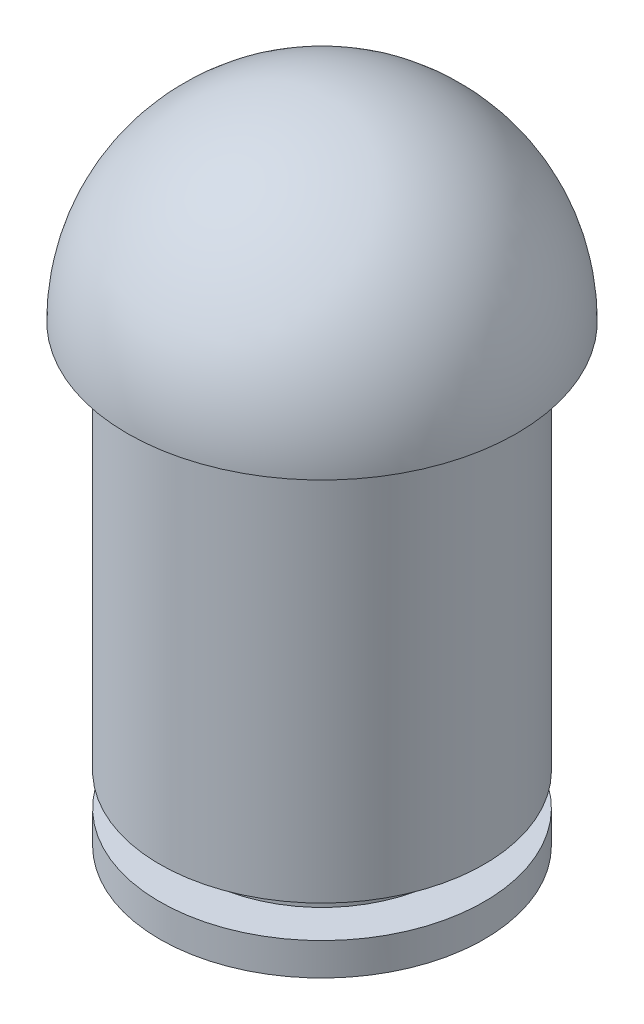
ISO-10303-21;
HEADER;
FILE_DESCRIPTION(('STEP AP214'),'2;1');
FILE_NAME('part.step','',(''),(''),'','','');
FILE_SCHEMA(('AUTOMOTIVE_DESIGN { 1 0 10303 214 1 1 1 1 }'));
ENDSEC;
DATA;
#1=APPLICATION_CONTEXT('core data for automotive mechanical design processes');
#2=APPLICATION_PROTOCOL_DEFINITION('international standard','automotive_design',2000,#1);
#3=PRODUCT_CONTEXT('',#1,'mechanical');
#4=PRODUCT('Part','Part','',(#3));
#5=PRODUCT_RELATED_PRODUCT_CATEGORY('part','',(#4));
#6=PRODUCT_DEFINITION_FORMATION('','',#4);
#7=PRODUCT_DEFINITION_CONTEXT('part definition',#1,'design');
#8=PRODUCT_DEFINITION('design','',#6,#7);
#9=PRODUCT_DEFINITION_SHAPE('','',#8);
#10=(LENGTH_UNIT() NAMED_UNIT(*) SI_UNIT(.MILLI.,.METRE.));
#11=(NAMED_UNIT(*) PLANE_ANGLE_UNIT() SI_UNIT($,.RADIAN.));
#12=(NAMED_UNIT(*) SI_UNIT($,.STERADIAN.) SOLID_ANGLE_UNIT());
#13=UNCERTAINTY_MEASURE_WITH_UNIT(LENGTH_MEASURE(1.E-05),#10,'distance_accuracy_value','');
#14=(GEOMETRIC_REPRESENTATION_CONTEXT(3) GLOBAL_UNCERTAINTY_ASSIGNED_CONTEXT((#13)) GLOBAL_UNIT_ASSIGNED_CONTEXT((#10,
#11,#12)) REPRESENTATION_CONTEXT('',''));
#15=CARTESIAN_POINT('',(0.,0.,0.));
#16=DIRECTION('',(0.,0.,1.));
#17=DIRECTION('',(1.,0.,0.));
#18=AXIS2_PLACEMENT_3D('',#15,#16,#17);
#19=CARTESIAN_POINT('',(0.,7.,0.));
#20=DIRECTION('',(0.,-1.,0.));
#21=DIRECTION('',(0.,0.,-1.));
#22=AXIS2_PLACEMENT_3D('',#19,#20,#21);
#23=CYLINDRICAL_SURFACE('',#22,2.5);
#24=CARTESIAN_POINT('',(0.,7.,0.));
#25=DIRECTION('',(0.,1.,0.));
#26=DIRECTION('',(0.,0.,1.));
#27=AXIS2_PLACEMENT_3D('',#24,#25,#26);
#28=CIRCLE('',#27,2.5);
#29=CARTESIAN_POINT('',(0.,7.,2.5));
#30=VERTEX_POINT('',#29);
#31=EDGE_CURVE('E10',#30,#30,#28,.T.);
#32=ORIENTED_EDGE('',*,*,#31,.F.);
#33=EDGE_LOOP('',(#32));
#34=FACE_BOUND('',#33,.T.);
#35=CARTESIAN_POINT('',(0.,1.,0.));
#36=DIRECTION('',(0.,1.,0.));
#37=DIRECTION('',(-1.,0.,0.));
#38=AXIS2_PLACEMENT_3D('',#35,#36,#37);
#39=CIRCLE('',#38,2.5);
#40=CARTESIAN_POINT('',(-2.5,1.,0.));
#41=VERTEX_POINT('',#40);
#42=EDGE_CURVE('E66',#41,#41,#39,.T.);
#43=ORIENTED_EDGE('',*,*,#42,.T.);
#44=EDGE_LOOP('',(#43));
#45=FACE_BOUND('',#44,.T.);
#46=ADVANCED_FACE('F37',(#34,#45),#23,.T.);
#47=CARTESIAN_POINT('',(0.,7.,0.));
#48=DIRECTION('',(0.,-1.,0.));
#49=DIRECTION('',(0.,0.,-1.));
#50=AXIS2_PLACEMENT_3D('',#47,#48,#49);
#51=PLANE('',#50);
#52=ORIENTED_EDGE('',*,*,#31,.T.);
#53=EDGE_LOOP('',(#52));
#54=FACE_BOUND('',#53,.T.);
#55=CARTESIAN_POINT('',(0.,7.,0.));
#56=DIRECTION('',(0.,-1.,0.));
#57=DIRECTION('',(0.,0.,-1.));
#58=AXIS2_PLACEMENT_3D('',#55,#56,#57);
#59=CIRCLE('',#58,3.);
#60=CARTESIAN_POINT('',(0.,7.,-3.));
#61=VERTEX_POINT('',#60);
#62=EDGE_CURVE('E49',#61,#61,#59,.T.);
#63=ORIENTED_EDGE('',*,*,#62,.T.);
#64=EDGE_LOOP('',(#63));
#65=FACE_BOUND('',#64,.T.);
#66=ADVANCED_FACE('F85',(#54,#65),#51,.T.);
#67=CARTESIAN_POINT('',(0.,7.,0.));
#68=DIRECTION('',(0.,-1.,0.));
#69=DIRECTION('',(1.,0.,0.));
#70=AXIS2_PLACEMENT_3D('',#67,#68,#69);
#71=SPHERICAL_SURFACE('',#70,3.);
#72=ORIENTED_EDGE('',*,*,#62,.F.);
#73=EDGE_LOOP('',(#72));
#74=FACE_BOUND('',#73,.T.);
#75=ADVANCED_FACE('F75',(#74),#71,.T.);
#76=CARTESIAN_POINT('',(2.5,1.,0.));
#77=DIRECTION('',(0.,-1.,0.));
#78=DIRECTION('',(1.,0.,0.));
#79=AXIS2_PLACEMENT_3D('',#76,#77,#78);
#80=PLANE('',#79);
#81=CARTESIAN_POINT('',(0.,1.,0.));
#82=DIRECTION('',(0.,1.,0.));
#83=DIRECTION('',(-1.,0.,0.));
#84=AXIS2_PLACEMENT_3D('',#81,#82,#83);
#85=CIRCLE('',#84,1.875);
#86=CARTESIAN_POINT('',(-1.875,1.,0.));
#87=VERTEX_POINT('',#86);
#88=EDGE_CURVE('E54',#87,#87,#85,.T.);
#89=ORIENTED_EDGE('',*,*,#88,.T.);
#90=EDGE_LOOP('',(#89));
#91=FACE_BOUND('',#90,.T.);
#92=ORIENTED_EDGE('',*,*,#42,.F.);
#93=EDGE_LOOP('',(#92));
#94=FACE_BOUND('',#93,.T.);
#95=ADVANCED_FACE('F72',(#91,#94),#80,.T.);
#96=CARTESIAN_POINT('',(0.,7.,0.));
#97=DIRECTION('',(0.,1.,0.));
#98=DIRECTION('',(-1.,0.,0.));
#99=AXIS2_PLACEMENT_3D('',#96,#97,#98);
#100=CYLINDRICAL_SURFACE('',#99,1.875);
#101=CARTESIAN_POINT('',(0.,0.5,0.));
#102=DIRECTION('',(0.,1.,0.));
#103=DIRECTION('',(-1.,0.,0.));
#104=AXIS2_PLACEMENT_3D('',#101,#102,#103);
#105=CIRCLE('',#104,1.875);
#106=CARTESIAN_POINT('',(-1.875,0.499999999999999,0.));
#107=VERTEX_POINT('',#106);
#108=EDGE_CURVE('E58',#107,#107,#105,.T.);
#109=ORIENTED_EDGE('',*,*,#108,.T.);
#110=EDGE_LOOP('',(#109));
#111=FACE_BOUND('',#110,.T.);
#112=ORIENTED_EDGE('',*,*,#88,.F.);
#113=EDGE_LOOP('',(#112));
#114=FACE_BOUND('',#113,.T.);
#115=ADVANCED_FACE('F74',(#111,#114),#100,.T.);
#116=CARTESIAN_POINT('',(1.875,0.5,0.));
#117=DIRECTION('',(0.,1.,0.));
#118=DIRECTION('',(-1.,0.,0.));
#119=AXIS2_PLACEMENT_3D('',#116,#117,#118);
#120=PLANE('',#119);
#121=CARTESIAN_POINT('',(0.,0.5,0.));
#122=DIRECTION('',(0.,1.,0.));
#123=DIRECTION('',(-1.,0.,0.));
#124=AXIS2_PLACEMENT_3D('',#121,#122,#123);
#125=CIRCLE('',#124,2.5);
#126=CARTESIAN_POINT('',(-2.5,0.499999999999999,0.));
#127=VERTEX_POINT('',#126);
#128=EDGE_CURVE('E62',#127,#127,#125,.T.);
#129=ORIENTED_EDGE('',*,*,#128,.T.);
#130=EDGE_LOOP('',(#129));
#131=FACE_BOUND('',#130,.T.);
#132=ORIENTED_EDGE('',*,*,#108,.F.);
#133=EDGE_LOOP('',(#132));
#134=FACE_BOUND('',#133,.T.);
#135=ADVANCED_FACE('F82',(#131,#134),#120,.T.);
#136=CARTESIAN_POINT('',(0.,0.,0.));
#137=DIRECTION('',(0.,1.,0.));
#138=DIRECTION('',(0.,0.,1.));
#139=AXIS2_PLACEMENT_3D('',#136,#137,#138);
#140=PLANE('',#139);
#141=CARTESIAN_POINT('',(0.,0.,0.));
#142=DIRECTION('',(0.,1.,0.));
#143=DIRECTION('',(0.,0.,1.));
#144=AXIS2_PLACEMENT_3D('',#141,#142,#143);
#145=CIRCLE('',#144,2.5);
#146=CARTESIAN_POINT('',(0.,0.,2.5));
#147=VERTEX_POINT('',#146);
#148=EDGE_CURVE('E40',#147,#147,#145,.T.);
#149=ORIENTED_EDGE('',*,*,#148,.F.);
#150=EDGE_LOOP('',(#149));
#151=FACE_BOUND('',#150,.T.);
#152=ADVANCED_FACE('F96',(#151),#140,.F.);
#153=ORIENTED_EDGE('',*,*,#148,.T.);
#154=EDGE_LOOP('',(#153));
#155=FACE_BOUND('',#154,.T.);
#156=ORIENTED_EDGE('',*,*,#128,.F.);
#157=EDGE_LOOP('',(#156));
#158=FACE_BOUND('',#157,.T.);
#159=ADVANCED_FACE('F90',(#155,#158),#23,.T.);
#160=CLOSED_SHELL('',(#46,#66,#75,#95,#115,#135,#152,#159));
#161=MANIFOLD_SOLID_BREP('B2',#160);
#162=ADVANCED_BREP_SHAPE_REPRESENTATION('',(#18,#161),#14);
#163=SHAPE_DEFINITION_REPRESENTATION(#9,#162);
ENDSEC;
END-ISO-10303-21;
